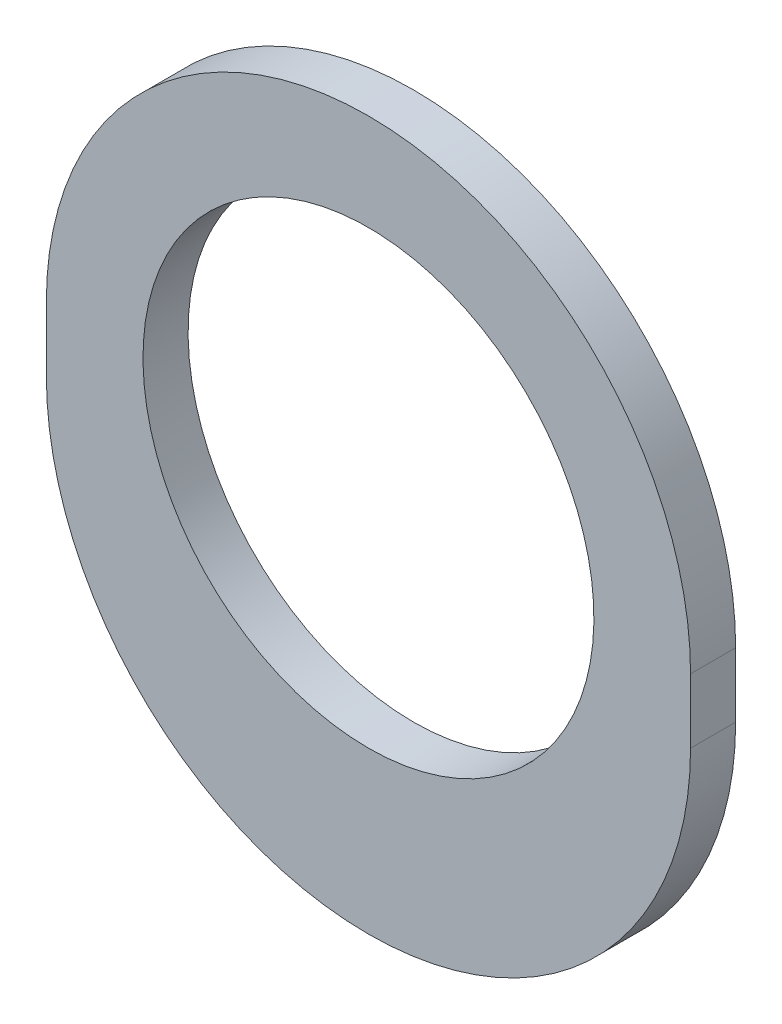
ISO-10303-21;
HEADER;
FILE_DESCRIPTION(('STEP AP214'),'2;1');
FILE_NAME('part.step','',(''),(''),'','','');
FILE_SCHEMA(('AUTOMOTIVE_DESIGN { 1 0 10303 214 1 1 1 1 }'));
ENDSEC;
DATA;
#1=APPLICATION_CONTEXT('core data for automotive mechanical design processes');
#2=APPLICATION_PROTOCOL_DEFINITION('international standard','automotive_design',2000,#1);
#3=PRODUCT_CONTEXT('',#1,'mechanical');
#4=PRODUCT('Part','Part','',(#3));
#5=PRODUCT_RELATED_PRODUCT_CATEGORY('part','',(#4));
#6=PRODUCT_DEFINITION_FORMATION('','',#4);
#7=PRODUCT_DEFINITION_CONTEXT('part definition',#1,'design');
#8=PRODUCT_DEFINITION('design','',#6,#7);
#9=PRODUCT_DEFINITION_SHAPE('','',#8);
#10=(LENGTH_UNIT() NAMED_UNIT(*) SI_UNIT(.MILLI.,.METRE.));
#11=(NAMED_UNIT(*) PLANE_ANGLE_UNIT() SI_UNIT($,.RADIAN.));
#12=(NAMED_UNIT(*) SI_UNIT($,.STERADIAN.) SOLID_ANGLE_UNIT());
#13=UNCERTAINTY_MEASURE_WITH_UNIT(LENGTH_MEASURE(1.E-05),#10,'distance_accuracy_value','');
#14=(GEOMETRIC_REPRESENTATION_CONTEXT(3) GLOBAL_UNCERTAINTY_ASSIGNED_CONTEXT((#13)) GLOBAL_UNIT_ASSIGNED_CONTEXT((#10,
#11,#12)) REPRESENTATION_CONTEXT('',''));
#15=CARTESIAN_POINT('',(0.,0.,0.));
#16=DIRECTION('',(0.,0.,1.));
#17=DIRECTION('',(1.,0.,0.));
#18=AXIS2_PLACEMENT_3D('',#15,#16,#17);
#19=CARTESIAN_POINT('',(131.59,-56.98,-0.045));
#20=DIRECTION('',(0.,0.,-1.));
#21=DIRECTION('',(1.624097681737E-13,-1.,0.));
#22=AXIS2_PLACEMENT_3D('',#19,#20,#21);
#23=CYLINDRICAL_SURFACE('',#22,0.175);
#24=CARTESIAN_POINT('',(131.59,-56.98,-0.035));
#25=DIRECTION('',(0.,0.,-1.));
#26=DIRECTION('',(1.624097681737E-13,-1.,0.));
#27=AXIS2_PLACEMENT_3D('',#24,#25,#26);
#28=CIRCLE('',#27,0.175);
#29=CARTESIAN_POINT('',(131.59,-57.155,-0.035));
#30=VERTEX_POINT('',#29);
#31=EDGE_CURVE('E126',#30,#30,#28,.T.);
#32=ORIENTED_EDGE('',*,*,#31,.T.);
#33=DIRECTION('',(0.,0.,1.));
#34=VECTOR('',#33,1.);
#35=CARTESIAN_POINT('',(131.59,-57.155,-0.045));
#36=LINE('',#35,#34);
#37=CARTESIAN_POINT('',(131.59,-57.155,0.));
#38=VERTEX_POINT('',#37);
#39=EDGE_CURVE('E11',#30,#38,#36,.T.);
#40=ORIENTED_EDGE('',*,*,#39,.T.);
#41=CARTESIAN_POINT('',(131.59,-56.98,0.));
#42=DIRECTION('',(0.,0.,-1.));
#43=DIRECTION('',(1.624097681737E-13,-1.,0.));
#44=AXIS2_PLACEMENT_3D('',#41,#42,#43);
#45=CIRCLE('',#44,0.175);
#46=EDGE_CURVE('E25',#38,#38,#45,.T.);
#47=ORIENTED_EDGE('',*,*,#46,.F.);
#48=ORIENTED_EDGE('',*,*,#39,.F.);
#49=EDGE_LOOP('',(#32,#40,#47,#48));
#50=FACE_BOUND('',#49,.T.);
#51=ADVANCED_FACE('F17',(#50),#23,.F.);
#52=CARTESIAN_POINT('',(131.84,-57.03,-0.035));
#53=DIRECTION('',(-1.,0.,0.));
#54=DIRECTION('',(0.,0.,1.));
#55=AXIS2_PLACEMENT_3D('',#52,#53,#54);
#56=PLANE('',#55);
#57=DIRECTION('',(0.,1.,0.));
#58=VECTOR('',#57,1.);
#59=CARTESIAN_POINT('',(131.84,-57.03,-0.035));
#60=LINE('',#59,#58);
#61=CARTESIAN_POINT('',(131.84,-57.03,-0.035));
#62=VERTEX_POINT('',#61);
#63=CARTESIAN_POINT('',(131.84,-56.98,-0.035));
#64=VERTEX_POINT('',#63);
#65=EDGE_CURVE('E81',#62,#64,#60,.T.);
#66=ORIENTED_EDGE('',*,*,#65,.T.);
#67=DIRECTION('',(0.,0.,1.));
#68=VECTOR('',#67,1.);
#69=CARTESIAN_POINT('',(131.84,-56.98,-0.035));
#70=LINE('',#69,#68);
#71=CARTESIAN_POINT('',(131.84,-56.98,0.));
#72=VERTEX_POINT('',#71);
#73=EDGE_CURVE('E87',#64,#72,#70,.T.);
#74=ORIENTED_EDGE('',*,*,#73,.T.);
#75=DIRECTION('',(0.,1.,0.));
#76=VECTOR('',#75,1.);
#77=CARTESIAN_POINT('',(131.84,-57.03,0.));
#78=LINE('',#77,#76);
#79=CARTESIAN_POINT('',(131.84,-57.03,0.));
#80=VERTEX_POINT('',#79);
#81=EDGE_CURVE('E129',#80,#72,#78,.T.);
#82=ORIENTED_EDGE('',*,*,#81,.F.);
#83=DIRECTION('',(0.,0.,1.));
#84=VECTOR('',#83,1.);
#85=CARTESIAN_POINT('',(131.84,-57.03,-0.035));
#86=LINE('',#85,#84);
#87=EDGE_CURVE('E86',#62,#80,#86,.T.);
#88=ORIENTED_EDGE('',*,*,#87,.F.);
#89=EDGE_LOOP('',(#66,#74,#82,#88));
#90=FACE_BOUND('',#89,.T.);
#91=ADVANCED_FACE('F140',(#90),#56,.F.);
#92=CARTESIAN_POINT('',(131.34,-56.98,0.));
#93=DIRECTION('',(0.,0.,1.));
#94=DIRECTION('',(1.,0.,0.));
#95=AXIS2_PLACEMENT_3D('',#92,#93,#94);
#96=PLANE('',#95);
#97=ORIENTED_EDGE('',*,*,#46,.T.);
#98=EDGE_LOOP('',(#97));
#99=FACE_BOUND('',#98,.T.);
#100=DIRECTION('',(0.,-1.,0.));
#101=VECTOR('',#100,1.);
#102=CARTESIAN_POINT('',(131.34,-56.98,0.));
#103=LINE('',#102,#101);
#104=CARTESIAN_POINT('',(131.34,-56.98,0.));
#105=VERTEX_POINT('',#104);
#106=CARTESIAN_POINT('',(131.34,-57.03,0.));
#107=VERTEX_POINT('',#106);
#108=EDGE_CURVE('E98',#105,#107,#103,.T.);
#109=ORIENTED_EDGE('',*,*,#108,.T.);
#110=CARTESIAN_POINT('',(131.59,-57.03,0.));
#111=DIRECTION('',(0.,0.,1.));
#112=DIRECTION('',(-1.,0.,0.));
#113=AXIS2_PLACEMENT_3D('',#110,#111,#112);
#114=CIRCLE('',#113,0.25);
#115=EDGE_CURVE('E93',#107,#80,#114,.T.);
#116=ORIENTED_EDGE('',*,*,#115,.T.);
#117=ORIENTED_EDGE('',*,*,#81,.T.);
#118=CARTESIAN_POINT('',(131.59,-56.98,0.));
#119=DIRECTION('',(0.,0.,1.));
#120=DIRECTION('',(1.,0.,0.));
#121=AXIS2_PLACEMENT_3D('',#118,#119,#120);
#122=CIRCLE('',#121,0.25);
#123=EDGE_CURVE('E117',#72,#105,#122,.T.);
#124=ORIENTED_EDGE('',*,*,#123,.T.);
#125=EDGE_LOOP('',(#109,#116,#117,#124));
#126=FACE_BOUND('',#125,.T.);
#127=ADVANCED_FACE('F136',(#99,#126),#96,.T.);
#128=CARTESIAN_POINT('',(131.34,-56.98,-0.035));
#129=DIRECTION('',(0.,0.,1.));
#130=DIRECTION('',(1.,0.,0.));
#131=AXIS2_PLACEMENT_3D('',#128,#129,#130);
#132=PLANE('',#131);
#133=ORIENTED_EDGE('',*,*,#31,.F.);
#134=EDGE_LOOP('',(#133));
#135=FACE_BOUND('',#134,.T.);
#136=CARTESIAN_POINT('',(131.59,-56.98,-0.035));
#137=DIRECTION('',(0.,0.,1.));
#138=DIRECTION('',(1.,0.,0.));
#139=AXIS2_PLACEMENT_3D('',#136,#137,#138);
#140=CIRCLE('',#139,0.25);
#141=CARTESIAN_POINT('',(131.34,-56.98,-0.035));
#142=VERTEX_POINT('',#141);
#143=EDGE_CURVE('E116',#64,#142,#140,.T.);
#144=ORIENTED_EDGE('',*,*,#143,.F.);
#145=ORIENTED_EDGE('',*,*,#65,.F.);
#146=CARTESIAN_POINT('',(131.59,-57.03,-0.035));
#147=DIRECTION('',(0.,0.,1.));
#148=DIRECTION('',(-1.,0.,0.));
#149=AXIS2_PLACEMENT_3D('',#146,#147,#148);
#150=CIRCLE('',#149,0.25);
#151=CARTESIAN_POINT('',(131.34,-57.03,-0.035));
#152=VERTEX_POINT('',#151);
#153=EDGE_CURVE('E75',#152,#62,#150,.T.);
#154=ORIENTED_EDGE('',*,*,#153,.F.);
#155=DIRECTION('',(0.,-1.,0.));
#156=VECTOR('',#155,1.);
#157=CARTESIAN_POINT('',(131.34,-56.98,-0.035));
#158=LINE('',#157,#156);
#159=EDGE_CURVE('E80',#142,#152,#158,.T.);
#160=ORIENTED_EDGE('',*,*,#159,.F.);
#161=EDGE_LOOP('',(#144,#145,#154,#160));
#162=FACE_BOUND('',#161,.T.);
#163=ADVANCED_FACE('F78',(#135,#162),#132,.F.);
#164=CARTESIAN_POINT('',(131.59,-57.03,-0.035));
#165=DIRECTION('',(0.,0.,-1.));
#166=DIRECTION('',(-1.,0.,0.));
#167=AXIS2_PLACEMENT_3D('',#164,#165,#166);
#168=CYLINDRICAL_SURFACE('',#167,0.25);
#169=ORIENTED_EDGE('',*,*,#153,.T.);
#170=ORIENTED_EDGE('',*,*,#87,.T.);
#171=ORIENTED_EDGE('',*,*,#115,.F.);
#172=DIRECTION('',(0.,0.,1.));
#173=VECTOR('',#172,1.);
#174=CARTESIAN_POINT('',(131.34,-57.03,-0.035));
#175=LINE('',#174,#173);
#176=EDGE_CURVE('E90',#152,#107,#175,.T.);
#177=ORIENTED_EDGE('',*,*,#176,.F.);
#178=EDGE_LOOP('',(#169,#170,#171,#177));
#179=FACE_BOUND('',#178,.T.);
#180=ADVANCED_FACE('F91',(#179),#168,.T.);
#181=CARTESIAN_POINT('',(131.59,-56.98,-0.035));
#182=DIRECTION('',(0.,0.,-1.));
#183=DIRECTION('',(1.,0.,0.));
#184=AXIS2_PLACEMENT_3D('',#181,#182,#183);
#185=CYLINDRICAL_SURFACE('',#184,0.25);
#186=ORIENTED_EDGE('',*,*,#143,.T.);
#187=DIRECTION('',(0.,0.,1.));
#188=VECTOR('',#187,1.);
#189=CARTESIAN_POINT('',(131.34,-56.98,-0.035));
#190=LINE('',#189,#188);
#191=EDGE_CURVE('E103',#142,#105,#190,.T.);
#192=ORIENTED_EDGE('',*,*,#191,.T.);
#193=ORIENTED_EDGE('',*,*,#123,.F.);
#194=ORIENTED_EDGE('',*,*,#73,.F.);
#195=EDGE_LOOP('',(#186,#192,#193,#194));
#196=FACE_BOUND('',#195,.T.);
#197=ADVANCED_FACE('F143',(#196),#185,.T.);
#198=CARTESIAN_POINT('',(131.34,-56.98,-0.035));
#199=DIRECTION('',(1.,0.,0.));
#200=DIRECTION('',(0.,1.,0.));
#201=AXIS2_PLACEMENT_3D('',#198,#199,#200);
#202=PLANE('',#201);
#203=ORIENTED_EDGE('',*,*,#159,.T.);
#204=ORIENTED_EDGE('',*,*,#176,.T.);
#205=ORIENTED_EDGE('',*,*,#108,.F.);
#206=ORIENTED_EDGE('',*,*,#191,.F.);
#207=EDGE_LOOP('',(#203,#204,#205,#206));
#208=FACE_BOUND('',#207,.T.);
#209=ADVANCED_FACE('F101',(#208),#202,.F.);
#210=CLOSED_SHELL('',(#51,#91,#127,#163,#180,#197,#209));
#211=MANIFOLD_SOLID_BREP('B1',#210);
#212=ADVANCED_BREP_SHAPE_REPRESENTATION('',(#18,#211),#14);
#213=SHAPE_DEFINITION_REPRESENTATION(#9,#212);
ENDSEC;
END-ISO-10303-21;
